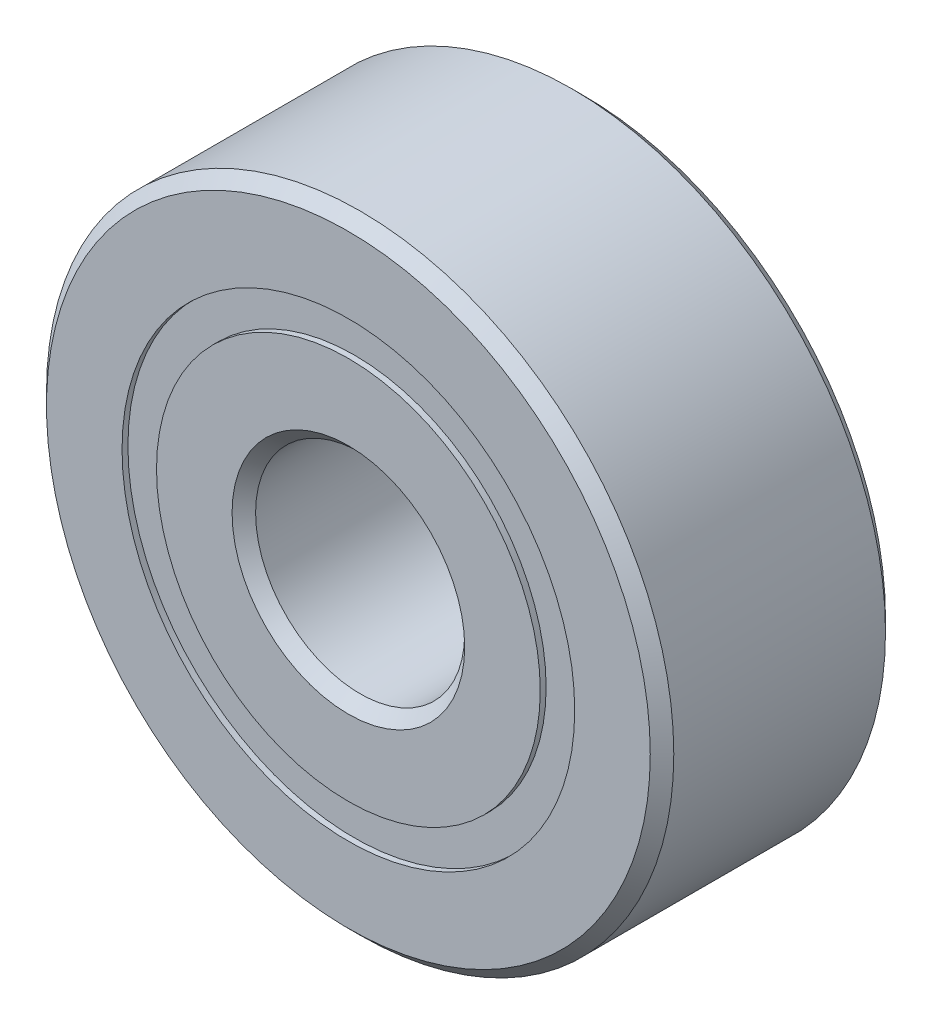
ISO-10303-21;
HEADER;
FILE_DESCRIPTION(('STEP AP214'),'2;1');
FILE_NAME('part.step','',(''),(''),'','','');
FILE_SCHEMA(('AUTOMOTIVE_DESIGN { 1 0 10303 214 1 1 1 1 }'));
ENDSEC;
DATA;
#1=APPLICATION_CONTEXT('core data for automotive mechanical design processes');
#2=APPLICATION_PROTOCOL_DEFINITION('international standard','automotive_design',2000,#1);
#3=PRODUCT_CONTEXT('',#1,'mechanical');
#4=PRODUCT('Part','Part','',(#3));
#5=PRODUCT_RELATED_PRODUCT_CATEGORY('part','',(#4));
#6=PRODUCT_DEFINITION_FORMATION('','',#4);
#7=PRODUCT_DEFINITION_CONTEXT('part definition',#1,'design');
#8=PRODUCT_DEFINITION('design','',#6,#7);
#9=PRODUCT_DEFINITION_SHAPE('','',#8);
#10=(LENGTH_UNIT() NAMED_UNIT(*) SI_UNIT(.MILLI.,.METRE.));
#11=(NAMED_UNIT(*) PLANE_ANGLE_UNIT() SI_UNIT($,.RADIAN.));
#12=(NAMED_UNIT(*) SI_UNIT($,.STERADIAN.) SOLID_ANGLE_UNIT());
#13=UNCERTAINTY_MEASURE_WITH_UNIT(LENGTH_MEASURE(1.E-05),#10,'distance_accuracy_value','');
#14=(GEOMETRIC_REPRESENTATION_CONTEXT(3) GLOBAL_UNCERTAINTY_ASSIGNED_CONTEXT((#13)) GLOBAL_UNIT_ASSIGNED_CONTEXT((#10,
#11,#12)) REPRESENTATION_CONTEXT('',''));
#15=CARTESIAN_POINT('',(0.,0.,0.));
#16=DIRECTION('',(0.,0.,1.));
#17=DIRECTION('',(1.,0.,0.));
#18=AXIS2_PLACEMENT_3D('',#15,#16,#17);
#19=CARTESIAN_POINT('',(0.,6.87335164835165,-3.39328125));
#20=DIRECTION('',(0.,0.,1.));
#21=DIRECTION('',(1.,0.,0.));
#22=AXIS2_PLACEMENT_3D('',#19,#20,#21);
#23=PLANE('',#22);
#24=CARTESIAN_POINT('',(0.,0.,-3.39328125));
#25=DIRECTION('',(0.,0.,1.));
#26=DIRECTION('',(1.,0.,0.));
#27=AXIS2_PLACEMENT_3D('',#24,#25,#26);
#28=CIRCLE('',#27,6.87335164835165);
#29=CARTESIAN_POINT('',(6.87335164835165,0.,-3.39328125));
#30=VERTEX_POINT('',#29);
#31=EDGE_CURVE('E58',#30,#30,#28,.T.);
#32=ORIENTED_EDGE('',*,*,#31,.F.);
#33=EDGE_LOOP('',(#32));
#34=FACE_BOUND('',#33,.T.);
#35=CARTESIAN_POINT('',(0.,0.,-3.39328125));
#36=DIRECTION('',(0.,0.,1.));
#37=DIRECTION('',(1.,0.,0.));
#38=AXIS2_PLACEMENT_3D('',#35,#36,#37);
#39=CIRCLE('',#38,5.82664835164835);
#40=CARTESIAN_POINT('',(5.82664835164835,0.,-3.39328125));
#41=VERTEX_POINT('',#40);
#42=EDGE_CURVE('E11',#41,#41,#39,.T.);
#43=ORIENTED_EDGE('',*,*,#42,.T.);
#44=EDGE_LOOP('',(#43));
#45=FACE_BOUND('',#44,.T.);
#46=ADVANCED_FACE('F44',(#34,#45),#23,.F.);
#47=CARTESIAN_POINT('',(0.,0.,3.571875));
#48=DIRECTION('',(0.,0.,1.));
#49=DIRECTION('',(1.,0.,0.));
#50=AXIS2_PLACEMENT_3D('',#47,#48,#49);
#51=CYLINDRICAL_SURFACE('',#50,5.82664835164835);
#52=ORIENTED_EDGE('',*,*,#42,.F.);
#53=EDGE_LOOP('',(#52));
#54=FACE_BOUND('',#53,.T.);
#55=CARTESIAN_POINT('',(0.,0.,-1.67154216154795));
#56=DIRECTION('',(0.,0.,1.));
#57=DIRECTION('',(1.,0.,0.));
#58=AXIS2_PLACEMENT_3D('',#55,#56,#57);
#59=CIRCLE('',#58,5.82664835164835);
#60=CARTESIAN_POINT('',(5.82664835164835,0.,-1.67154216154795));
#61=VERTEX_POINT('',#60);
#62=EDGE_CURVE('E50',#61,#61,#59,.T.);
#63=ORIENTED_EDGE('',*,*,#62,.T.);
#64=EDGE_LOOP('',(#63));
#65=FACE_BOUND('',#64,.T.);
#66=ADVANCED_FACE('F67',(#54,#65),#51,.F.);
#67=CARTESIAN_POINT('',(0.,6.87335164835165,-1.67154216154795));
#68=DIRECTION('',(0.,0.,-1.));
#69=DIRECTION('',(-1.,0.,0.));
#70=AXIS2_PLACEMENT_3D('',#67,#68,#69);
#71=PLANE('',#70);
#72=ORIENTED_EDGE('',*,*,#62,.F.);
#73=EDGE_LOOP('',(#72));
#74=FACE_BOUND('',#73,.T.);
#75=CARTESIAN_POINT('',(0.,0.,-1.67154216154795));
#76=DIRECTION('',(0.,0.,1.));
#77=DIRECTION('',(1.,0.,0.));
#78=AXIS2_PLACEMENT_3D('',#75,#76,#77);
#79=CIRCLE('',#78,6.87335164835165);
#80=CARTESIAN_POINT('',(6.87335164835165,0.,-1.67154216154795));
#81=VERTEX_POINT('',#80);
#82=EDGE_CURVE('E54',#81,#81,#79,.T.);
#83=ORIENTED_EDGE('',*,*,#82,.T.);
#84=EDGE_LOOP('',(#83));
#85=FACE_BOUND('',#84,.T.);
#86=ADVANCED_FACE('F71',(#74,#85),#71,.F.);
#87=CARTESIAN_POINT('',(0.,0.,3.571875));
#88=DIRECTION('',(0.,0.,1.));
#89=DIRECTION('',(1.,0.,0.));
#90=AXIS2_PLACEMENT_3D('',#87,#88,#89);
#91=CYLINDRICAL_SURFACE('',#90,6.87335164835165);
#92=ORIENTED_EDGE('',*,*,#82,.F.);
#93=EDGE_LOOP('',(#92));
#94=FACE_BOUND('',#93,.T.);
#95=ORIENTED_EDGE('',*,*,#31,.T.);
#96=EDGE_LOOP('',(#95));
#97=FACE_BOUND('',#96,.T.);
#98=ADVANCED_FACE('F64',(#94,#97),#91,.T.);
#99=CLOSED_SHELL('',(#46,#66,#86,#98));
#100=MANIFOLD_SOLID_BREP('B2',#99);
#101=CARTESIAN_POINT('',(0.,6.87335164835165,3.39328125));
#102=DIRECTION('',(0.,0.,-1.));
#103=DIRECTION('',(-1.,0.,0.));
#104=AXIS2_PLACEMENT_3D('',#101,#102,#103);
#105=PLANE('',#104);
#106=CARTESIAN_POINT('',(0.,0.,3.39328125));
#107=DIRECTION('',(0.,0.,1.));
#108=DIRECTION('',(1.,0.,0.));
#109=AXIS2_PLACEMENT_3D('',#106,#107,#108);
#110=CIRCLE('',#109,5.82664835164835);
#111=CARTESIAN_POINT('',(5.82664835164835,0.,3.39328125));
#112=VERTEX_POINT('',#111);
#113=EDGE_CURVE('E43',#112,#112,#110,.T.);
#114=ORIENTED_EDGE('',*,*,#113,.F.);
#115=EDGE_LOOP('',(#114));
#116=FACE_BOUND('',#115,.T.);
#117=CARTESIAN_POINT('',(0.,0.,3.39328125));
#118=DIRECTION('',(0.,0.,1.));
#119=DIRECTION('',(1.,0.,0.));
#120=AXIS2_PLACEMENT_3D('',#117,#118,#119);
#121=CIRCLE('',#120,6.87335164835165);
#122=CARTESIAN_POINT('',(6.87335164835165,0.,3.39328125));
#123=VERTEX_POINT('',#122);
#124=EDGE_CURVE('E126',#123,#123,#121,.T.);
#125=ORIENTED_EDGE('',*,*,#124,.T.);
#126=EDGE_LOOP('',(#125));
#127=FACE_BOUND('',#126,.T.);
#128=ADVANCED_FACE('F112',(#116,#127),#105,.F.);
#129=CARTESIAN_POINT('',(0.,0.,3.571875));
#130=DIRECTION('',(0.,0.,1.));
#131=DIRECTION('',(1.,0.,0.));
#132=AXIS2_PLACEMENT_3D('',#129,#130,#131);
#133=CYLINDRICAL_SURFACE('',#132,5.82664835164835);
#134=CARTESIAN_POINT('',(0.,0.,1.67154216154795));
#135=DIRECTION('',(0.,0.,1.));
#136=DIRECTION('',(1.,0.,0.));
#137=AXIS2_PLACEMENT_3D('',#134,#135,#136);
#138=CIRCLE('',#137,5.82664835164835);
#139=CARTESIAN_POINT('',(5.82664835164835,0.,1.67154216154795));
#140=VERTEX_POINT('',#139);
#141=EDGE_CURVE('E118',#140,#140,#138,.T.);
#142=ORIENTED_EDGE('',*,*,#141,.F.);
#143=EDGE_LOOP('',(#142));
#144=FACE_BOUND('',#143,.T.);
#145=ORIENTED_EDGE('',*,*,#113,.T.);
#146=EDGE_LOOP('',(#145));
#147=FACE_BOUND('',#146,.T.);
#148=ADVANCED_FACE('F141',(#144,#147),#133,.F.);
#149=CARTESIAN_POINT('',(0.,6.87335164835165,1.67154216154795));
#150=DIRECTION('',(0.,0.,1.));
#151=DIRECTION('',(1.,0.,0.));
#152=AXIS2_PLACEMENT_3D('',#149,#150,#151);
#153=PLANE('',#152);
#154=CARTESIAN_POINT('',(0.,0.,1.67154216154795));
#155=DIRECTION('',(0.,0.,1.));
#156=DIRECTION('',(1.,0.,0.));
#157=AXIS2_PLACEMENT_3D('',#154,#155,#156);
#158=CIRCLE('',#157,6.87335164835165);
#159=CARTESIAN_POINT('',(6.87335164835165,0.,1.67154216154795));
#160=VERTEX_POINT('',#159);
#161=EDGE_CURVE('E122',#160,#160,#158,.T.);
#162=ORIENTED_EDGE('',*,*,#161,.F.);
#163=EDGE_LOOP('',(#162));
#164=FACE_BOUND('',#163,.T.);
#165=ORIENTED_EDGE('',*,*,#141,.T.);
#166=EDGE_LOOP('',(#165));
#167=FACE_BOUND('',#166,.T.);
#168=ADVANCED_FACE('F136',(#164,#167),#153,.F.);
#169=CARTESIAN_POINT('',(0.,0.,3.571875));
#170=DIRECTION('',(0.,0.,1.));
#171=DIRECTION('',(1.,0.,0.));
#172=AXIS2_PLACEMENT_3D('',#169,#170,#171);
#173=CYLINDRICAL_SURFACE('',#172,6.87335164835165);
#174=ORIENTED_EDGE('',*,*,#124,.F.);
#175=EDGE_LOOP('',(#174));
#176=FACE_BOUND('',#175,.T.);
#177=ORIENTED_EDGE('',*,*,#161,.T.);
#178=EDGE_LOOP('',(#177));
#179=FACE_BOUND('',#178,.T.);
#180=ADVANCED_FACE('F133',(#176,#179),#173,.T.);
#181=CLOSED_SHELL('',(#128,#148,#168,#180));
#182=MANIFOLD_SOLID_BREP('B6',#181);
#183=CARTESIAN_POINT('',(-4.49012806053452,4.49012806053463,0.));
#184=DIRECTION('',(0.,0.,1.));
#185=DIRECTION('',(-0.707106781186539,0.707106781186556,0.));
#186=AXIS2_PLACEMENT_3D('',#183,#184,#185);
#187=SPHERICAL_SURFACE('',#186,1.67154216154795);
#188=CARTESIAN_POINT('',(-4.49012806053452,4.49012806053463,1.67154216154795));
#189=VERTEX_POINT('',#188);
#190=VERTEX_LOOP('',#189);
#191=FACE_BOUND('',#190,.T.);
#192=ADVANCED_FACE('F180',(#191),#187,.T.);
#193=CLOSED_SHELL('',(#192));
#194=MANIFOLD_SOLID_BREP('B38',#193);
#195=CARTESIAN_POINT('',(-6.35,0.,0.));
#196=DIRECTION('',(0.,0.,1.));
#197=DIRECTION('',(-1.,0.,0.));
#198=AXIS2_PLACEMENT_3D('',#195,#196,#197);
#199=SPHERICAL_SURFACE('',#198,1.67154216154795);
#200=CARTESIAN_POINT('',(-6.35,0.,1.67154216154795));
#201=VERTEX_POINT('',#200);
#202=VERTEX_LOOP('',#201);
#203=FACE_BOUND('',#202,.T.);
#204=ADVANCED_FACE('F201',(#203),#199,.T.);
#205=CLOSED_SHELL('',(#204));
#206=MANIFOLD_SOLID_BREP('B108',#205);
#207=CARTESIAN_POINT('',(-4.49012806053462,-4.49012806053454,0.));
#208=DIRECTION('',(0.,0.,1.));
#209=DIRECTION('',(-0.707106781186554,-0.707106781186541,0.));
#210=AXIS2_PLACEMENT_3D('',#207,#208,#209);
#211=SPHERICAL_SURFACE('',#210,1.67154216154795);
#212=CARTESIAN_POINT('',(-4.49012806053462,-4.49012806053454,1.67154216154795));
#213=VERTEX_POINT('',#212);
#214=VERTEX_LOOP('',#213);
#215=FACE_BOUND('',#214,.T.);
#216=ADVANCED_FACE('F222',(#215),#211,.T.);
#217=CLOSED_SHELL('',(#216));
#218=MANIFOLD_SOLID_BREP('B176',#217);
#219=CARTESIAN_POINT('',(0.,-6.35,0.));
#220=DIRECTION('',(0.,0.,1.));
#221=DIRECTION('',(0.,-1.,0.));
#222=AXIS2_PLACEMENT_3D('',#219,#220,#221);
#223=SPHERICAL_SURFACE('',#222,1.67154216154795);
#224=CARTESIAN_POINT('',(0.,-6.35,1.67154216154795));
#225=VERTEX_POINT('',#224);
#226=VERTEX_LOOP('',#225);
#227=FACE_BOUND('',#226,.T.);
#228=ADVANCED_FACE('F243',(#227),#223,.T.);
#229=CLOSED_SHELL('',(#228));
#230=MANIFOLD_SOLID_BREP('B197',#229);
#231=CARTESIAN_POINT('',(4.49012806053455,-4.4901280605346,0.));
#232=DIRECTION('',(0.,0.,1.));
#233=DIRECTION('',(0.707106781186544,-0.707106781186551,0.));
#234=AXIS2_PLACEMENT_3D('',#231,#232,#233);
#235=SPHERICAL_SURFACE('',#234,1.67154216154795);
#236=CARTESIAN_POINT('',(4.49012806053455,-4.4901280605346,1.67154216154795));
#237=VERTEX_POINT('',#236);
#238=VERTEX_LOOP('',#237);
#239=FACE_BOUND('',#238,.T.);
#240=ADVANCED_FACE('F264',(#239),#235,.T.);
#241=CLOSED_SHELL('',(#240));
#242=MANIFOLD_SOLID_BREP('B218',#241);
#243=CARTESIAN_POINT('',(6.35,0.,0.));
#244=DIRECTION('',(0.,0.,1.));
#245=DIRECTION('',(1.,0.,0.));
#246=AXIS2_PLACEMENT_3D('',#243,#244,#245);
#247=SPHERICAL_SURFACE('',#246,1.67154216154795);
#248=CARTESIAN_POINT('',(6.35,0.,1.67154216154795));
#249=VERTEX_POINT('',#248);
#250=VERTEX_LOOP('',#249);
#251=FACE_BOUND('',#250,.T.);
#252=ADVANCED_FACE('F285',(#251),#247,.T.);
#253=CLOSED_SHELL('',(#252));
#254=MANIFOLD_SOLID_BREP('B239',#253);
#255=CARTESIAN_POINT('',(4.49012806053458,4.49012806053457,0.));
#256=DIRECTION('',(0.,0.,1.));
#257=DIRECTION('',(0.707106781186549,0.707106781186546,0.));
#258=AXIS2_PLACEMENT_3D('',#255,#256,#257);
#259=SPHERICAL_SURFACE('',#258,1.67154216154795);
#260=CARTESIAN_POINT('',(4.49012806053458,4.49012806053457,1.67154216154795));
#261=VERTEX_POINT('',#260);
#262=VERTEX_LOOP('',#261);
#263=FACE_BOUND('',#262,.T.);
#264=ADVANCED_FACE('F306',(#263),#259,.T.);
#265=CLOSED_SHELL('',(#264));
#266=MANIFOLD_SOLID_BREP('B260',#265);
#267=CARTESIAN_POINT('',(0.,6.35,0.));
#268=DIRECTION('',(0.,0.,1.));
#269=DIRECTION('',(0.,1.,0.));
#270=AXIS2_PLACEMENT_3D('',#267,#268,#269);
#271=SPHERICAL_SURFACE('',#270,1.67154216154795);
#272=CARTESIAN_POINT('',(0.,6.35,1.67154216154795));
#273=VERTEX_POINT('',#272);
#274=VERTEX_LOOP('',#273);
#275=FACE_BOUND('',#274,.T.);
#276=ADVANCED_FACE('F329',(#275),#271,.T.);
#277=CLOSED_SHELL('',(#276));
#278=MANIFOLD_SOLID_BREP('B281',#277);
#279=CARTESIAN_POINT('',(0.,5.82664835164835,3.571875));
#280=DIRECTION('',(0.,0.,-1.));
#281=DIRECTION('',(-1.,0.,0.));
#282=AXIS2_PLACEMENT_3D('',#279,#280,#281);
#283=PLANE('',#282);
#284=CARTESIAN_POINT('',(0.,0.,3.571875));
#285=DIRECTION('',(0.,0.,1.));
#286=DIRECTION('',(1.,0.,0.));
#287=AXIS2_PLACEMENT_3D('',#284,#285,#286);
#288=CIRCLE('',#287,3.5321875);
#289=CARTESIAN_POINT('',(3.5321875,0.,3.571875));
#290=VERTEX_POINT('',#289);
#291=EDGE_CURVE('E377',#290,#290,#288,.T.);
#292=ORIENTED_EDGE('',*,*,#291,.F.);
#293=EDGE_LOOP('',(#292));
#294=FACE_BOUND('',#293,.T.);
#295=CARTESIAN_POINT('',(0.,0.,3.571875));
#296=DIRECTION('',(0.,0.,1.));
#297=DIRECTION('',(1.,0.,0.));
#298=AXIS2_PLACEMENT_3D('',#295,#296,#297);
#299=CIRCLE('',#298,5.82664835164835);
#300=CARTESIAN_POINT('',(5.82664835164835,0.,3.571875));
#301=VERTEX_POINT('',#300);
#302=EDGE_CURVE('E328',#301,#301,#299,.T.);
#303=ORIENTED_EDGE('',*,*,#302,.T.);
#304=EDGE_LOOP('',(#303));
#305=FACE_BOUND('',#304,.T.);
#306=ADVANCED_FACE('F349',(#294,#305),#283,.F.);
#307=CARTESIAN_POINT('',(0.,0.,3.571875));
#308=DIRECTION('',(0.,0.,1.));
#309=DIRECTION('',(1.,0.,0.));
#310=AXIS2_PLACEMENT_3D('',#307,#308,#309);
#311=CYLINDRICAL_SURFACE('',#310,5.82664835164835);
#312=ORIENTED_EDGE('',*,*,#302,.F.);
#313=EDGE_LOOP('',(#312));
#314=FACE_BOUND('',#313,.T.);
#315=CARTESIAN_POINT('',(0.,0.,1.5875));
#316=DIRECTION('',(0.,0.,1.));
#317=DIRECTION('',(1.,0.,0.));
#318=AXIS2_PLACEMENT_3D('',#315,#316,#317);
#319=CIRCLE('',#318,5.82664835164835);
#320=CARTESIAN_POINT('',(5.82664835164835,0.,1.5875));
#321=VERTEX_POINT('',#320);
#322=EDGE_CURVE('E355',#321,#321,#319,.T.);
#323=ORIENTED_EDGE('',*,*,#322,.T.);
#324=EDGE_LOOP('',(#323));
#325=FACE_BOUND('',#324,.T.);
#326=ADVANCED_FACE('F384',(#314,#325),#311,.T.);
#327=CARTESIAN_POINT('',(0.,0.,0.));
#328=DIRECTION('',(0.,0.,1.));
#329=DIRECTION('',(1.,0.,0.));
#330=AXIS2_PLACEMENT_3D('',#327,#328,#329);
#331=TOROIDAL_SURFACE('',#330,6.35,1.67154216154795);
#332=ORIENTED_EDGE('',*,*,#322,.F.);
#333=EDGE_LOOP('',(#332));
#334=FACE_BOUND('',#333,.T.);
#335=CARTESIAN_POINT('',(0.,0.,-1.5875));
#336=DIRECTION('',(0.,0.,1.));
#337=DIRECTION('',(1.,0.,0.));
#338=AXIS2_PLACEMENT_3D('',#335,#336,#337);
#339=CIRCLE('',#338,5.82664835164835);
#340=CARTESIAN_POINT('',(5.82664835164835,0.,-1.5875));
#341=VERTEX_POINT('',#340);
#342=EDGE_CURVE('E359',#341,#341,#339,.T.);
#343=ORIENTED_EDGE('',*,*,#342,.T.);
#344=EDGE_LOOP('',(#343));
#345=FACE_BOUND('',#344,.T.);
#346=ADVANCED_FACE('F388',(#334,#345),#331,.F.);
#347=CARTESIAN_POINT('',(0.,0.,3.571875));
#348=DIRECTION('',(0.,0.,1.));
#349=DIRECTION('',(1.,0.,0.));
#350=AXIS2_PLACEMENT_3D('',#347,#348,#349);
#351=CYLINDRICAL_SURFACE('',#350,5.82664835164835);
#352=ORIENTED_EDGE('',*,*,#342,.F.);
#353=EDGE_LOOP('',(#352));
#354=FACE_BOUND('',#353,.T.);
#355=CARTESIAN_POINT('',(0.,0.,-3.571875));
#356=DIRECTION('',(0.,0.,1.));
#357=DIRECTION('',(1.,0.,0.));
#358=AXIS2_PLACEMENT_3D('',#355,#356,#357);
#359=CIRCLE('',#358,5.82664835164835);
#360=CARTESIAN_POINT('',(5.82664835164835,0.,-3.571875));
#361=VERTEX_POINT('',#360);
#362=EDGE_CURVE('E363',#361,#361,#359,.T.);
#363=ORIENTED_EDGE('',*,*,#362,.T.);
#364=EDGE_LOOP('',(#363));
#365=FACE_BOUND('',#364,.T.);
#366=ADVANCED_FACE('F393',(#354,#365),#351,.T.);
#367=CARTESIAN_POINT('',(0.,3.5321875,-3.571875));
#368=DIRECTION('',(0.,0.,1.));
#369=DIRECTION('',(1.,0.,0.));
#370=AXIS2_PLACEMENT_3D('',#367,#368,#369);
#371=PLANE('',#370);
#372=ORIENTED_EDGE('',*,*,#362,.F.);
#373=EDGE_LOOP('',(#372));
#374=FACE_BOUND('',#373,.T.);
#375=CARTESIAN_POINT('',(0.,0.,-3.571875));
#376=DIRECTION('',(0.,0.,1.));
#377=DIRECTION('',(1.,0.,0.));
#378=AXIS2_PLACEMENT_3D('',#375,#376,#377);
#379=CIRCLE('',#378,3.5321875);
#380=CARTESIAN_POINT('',(3.5321875,0.,-3.571875));
#381=VERTEX_POINT('',#380);
#382=EDGE_CURVE('E368',#381,#381,#379,.T.);
#383=ORIENTED_EDGE('',*,*,#382,.T.);
#384=EDGE_LOOP('',(#383));
#385=FACE_BOUND('',#384,.T.);
#386=ADVANCED_FACE('F399',(#374,#385),#371,.F.);
#387=CARTESIAN_POINT('',(0.,0.,-3.2146875));
#388=DIRECTION('',(0.,0.,-1.));
#389=DIRECTION('',(-1.,0.,0.));
#390=AXIS2_PLACEMENT_3D('',#387,#388,#389);
#391=CONICAL_SURFACE('',#390,3.175,0.785398163397444);
#392=ORIENTED_EDGE('',*,*,#382,.F.);
#393=EDGE_LOOP('',(#392));
#394=FACE_BOUND('',#393,.T.);
#395=CARTESIAN_POINT('',(0.,0.,-3.2146875));
#396=DIRECTION('',(0.,0.,1.));
#397=DIRECTION('',(1.,0.,0.));
#398=AXIS2_PLACEMENT_3D('',#395,#396,#397);
#399=CIRCLE('',#398,3.175);
#400=CARTESIAN_POINT('',(3.175,0.,-3.2146875));
#401=VERTEX_POINT('',#400);
#402=EDGE_CURVE('E371',#401,#401,#399,.T.);
#403=ORIENTED_EDGE('',*,*,#402,.T.);
#404=EDGE_LOOP('',(#403));
#405=FACE_BOUND('',#404,.T.);
#406=ADVANCED_FACE('F403',(#394,#405),#391,.F.);
#407=CARTESIAN_POINT('',(0.,0.,3.571875));
#408=DIRECTION('',(0.,0.,1.));
#409=DIRECTION('',(1.,0.,0.));
#410=AXIS2_PLACEMENT_3D('',#407,#408,#409);
#411=CYLINDRICAL_SURFACE('',#410,3.175);
#412=ORIENTED_EDGE('',*,*,#402,.F.);
#413=EDGE_LOOP('',(#412));
#414=FACE_BOUND('',#413,.T.);
#415=CARTESIAN_POINT('',(0.,0.,3.2146875));
#416=DIRECTION('',(0.,0.,1.));
#417=DIRECTION('',(1.,0.,0.));
#418=AXIS2_PLACEMENT_3D('',#415,#416,#417);
#419=CIRCLE('',#418,3.175);
#420=CARTESIAN_POINT('',(3.175,0.,3.2146875));
#421=VERTEX_POINT('',#420);
#422=EDGE_CURVE('E374',#421,#421,#419,.T.);
#423=ORIENTED_EDGE('',*,*,#422,.T.);
#424=EDGE_LOOP('',(#423));
#425=FACE_BOUND('',#424,.T.);
#426=ADVANCED_FACE('F407',(#414,#425),#411,.F.);
#427=CARTESIAN_POINT('',(0.,0.,3.571875));
#428=DIRECTION('',(0.,0.,1.));
#429=DIRECTION('',(1.,0.,0.));
#430=AXIS2_PLACEMENT_3D('',#427,#428,#429);
#431=CONICAL_SURFACE('',#430,3.5321875,0.785398163397454);
#432=ORIENTED_EDGE('',*,*,#422,.F.);
#433=EDGE_LOOP('',(#432));
#434=FACE_BOUND('',#433,.T.);
#435=ORIENTED_EDGE('',*,*,#291,.T.);
#436=EDGE_LOOP('',(#435));
#437=FACE_BOUND('',#436,.T.);
#438=ADVANCED_FACE('F381',(#434,#437),#431,.F.);
#439=CLOSED_SHELL('',(#306,#326,#346,#366,#386,#406,#426,#438));
#440=MANIFOLD_SOLID_BREP('B302',#439);
#441=CARTESIAN_POINT('',(0.,0.,3.2146875));
#442=DIRECTION('',(0.,0.,-1.));
#443=DIRECTION('',(-1.,0.,0.));
#444=AXIS2_PLACEMENT_3D('',#441,#442,#443);
#445=CONICAL_SURFACE('',#444,9.525,0.785398163397448);
#446=CARTESIAN_POINT('',(0.,0.,3.571875));
#447=DIRECTION('',(0.,0.,1.));
#448=DIRECTION('',(1.,0.,0.));
#449=AXIS2_PLACEMENT_3D('',#446,#447,#448);
#450=CIRCLE('',#449,9.1678125);
#451=CARTESIAN_POINT('',(9.1678125,0.,3.571875));
#452=VERTEX_POINT('',#451);
#453=EDGE_CURVE('E499',#452,#452,#450,.T.);
#454=ORIENTED_EDGE('',*,*,#453,.F.);
#455=EDGE_LOOP('',(#454));
#456=FACE_BOUND('',#455,.T.);
#457=CARTESIAN_POINT('',(0.,0.,3.2146875));
#458=DIRECTION('',(0.,0.,1.));
#459=DIRECTION('',(1.,0.,0.));
#460=AXIS2_PLACEMENT_3D('',#457,#458,#459);
#461=CIRCLE('',#460,9.525);
#462=CARTESIAN_POINT('',(9.525,0.,3.2146875));
#463=VERTEX_POINT('',#462);
#464=EDGE_CURVE('E348',#463,#463,#461,.T.);
#465=ORIENTED_EDGE('',*,*,#464,.T.);
#466=EDGE_LOOP('',(#465));
#467=FACE_BOUND('',#466,.T.);
#468=ADVANCED_FACE('F471',(#456,#467),#445,.T.);
#469=CARTESIAN_POINT('',(0.,0.,3.571875));
#470=DIRECTION('',(0.,0.,1.));
#471=DIRECTION('',(1.,0.,0.));
#472=AXIS2_PLACEMENT_3D('',#469,#470,#471);
#473=CYLINDRICAL_SURFACE('',#472,9.525);
#474=ORIENTED_EDGE('',*,*,#464,.F.);
#475=EDGE_LOOP('',(#474));
#476=FACE_BOUND('',#475,.T.);
#477=CARTESIAN_POINT('',(0.,0.,-3.2146875));
#478=DIRECTION('',(0.,0.,1.));
#479=DIRECTION('',(1.,0.,0.));
#480=AXIS2_PLACEMENT_3D('',#477,#478,#479);
#481=CIRCLE('',#480,9.525);
#482=CARTESIAN_POINT('',(9.525,0.,-3.2146875));
#483=VERTEX_POINT('',#482);
#484=EDGE_CURVE('E477',#483,#483,#481,.T.);
#485=ORIENTED_EDGE('',*,*,#484,.T.);
#486=EDGE_LOOP('',(#485));
#487=FACE_BOUND('',#486,.T.);
#488=ADVANCED_FACE('F506',(#476,#487),#473,.T.);
#489=CARTESIAN_POINT('',(0.,0.,-3.571875));
#490=DIRECTION('',(0.,0.,1.));
#491=DIRECTION('',(1.,0.,0.));
#492=AXIS2_PLACEMENT_3D('',#489,#490,#491);
#493=CONICAL_SURFACE('',#492,9.1678125,0.785398163397445);
#494=ORIENTED_EDGE('',*,*,#484,.F.);
#495=EDGE_LOOP('',(#494));
#496=FACE_BOUND('',#495,.T.);
#497=CARTESIAN_POINT('',(0.,0.,-3.571875));
#498=DIRECTION('',(0.,0.,1.));
#499=DIRECTION('',(1.,0.,0.));
#500=AXIS2_PLACEMENT_3D('',#497,#498,#499);
#501=CIRCLE('',#500,9.1678125);
#502=CARTESIAN_POINT('',(9.1678125,0.,-3.571875));
#503=VERTEX_POINT('',#502);
#504=EDGE_CURVE('E481',#503,#503,#501,.T.);
#505=ORIENTED_EDGE('',*,*,#504,.T.);
#506=EDGE_LOOP('',(#505));
#507=FACE_BOUND('',#506,.T.);
#508=ADVANCED_FACE('F510',(#496,#507),#493,.T.);
#509=CARTESIAN_POINT('',(0.,9.1678125,-3.571875));
#510=DIRECTION('',(0.,0.,1.));
#511=DIRECTION('',(1.,0.,0.));
#512=AXIS2_PLACEMENT_3D('',#509,#510,#511);
#513=PLANE('',#512);
#514=ORIENTED_EDGE('',*,*,#504,.F.);
#515=EDGE_LOOP('',(#514));
#516=FACE_BOUND('',#515,.T.);
#517=CARTESIAN_POINT('',(0.,0.,-3.571875));
#518=DIRECTION('',(0.,0.,1.));
#519=DIRECTION('',(1.,0.,0.));
#520=AXIS2_PLACEMENT_3D('',#517,#518,#519);
#521=CIRCLE('',#520,6.87335164835165);
#522=CARTESIAN_POINT('',(6.87335164835165,0.,-3.571875));
#523=VERTEX_POINT('',#522);
#524=EDGE_CURVE('E485',#523,#523,#521,.T.);
#525=ORIENTED_EDGE('',*,*,#524,.T.);
#526=EDGE_LOOP('',(#525));
#527=FACE_BOUND('',#526,.T.);
#528=ADVANCED_FACE('F515',(#516,#527),#513,.F.);
#529=CARTESIAN_POINT('',(0.,0.,3.571875));
#530=DIRECTION('',(0.,0.,1.));
#531=DIRECTION('',(1.,0.,0.));
#532=AXIS2_PLACEMENT_3D('',#529,#530,#531);
#533=CYLINDRICAL_SURFACE('',#532,6.87335164835165);
#534=ORIENTED_EDGE('',*,*,#524,.F.);
#535=EDGE_LOOP('',(#534));
#536=FACE_BOUND('',#535,.T.);
#537=CARTESIAN_POINT('',(0.,0.,-1.5875));
#538=DIRECTION('',(0.,0.,1.));
#539=DIRECTION('',(1.,0.,0.));
#540=AXIS2_PLACEMENT_3D('',#537,#538,#539);
#541=CIRCLE('',#540,6.87335164835165);
#542=CARTESIAN_POINT('',(6.87335164835165,0.,-1.5875));
#543=VERTEX_POINT('',#542);
#544=EDGE_CURVE('E490',#543,#543,#541,.T.);
#545=ORIENTED_EDGE('',*,*,#544,.T.);
#546=EDGE_LOOP('',(#545));
#547=FACE_BOUND('',#546,.T.);
#548=ADVANCED_FACE('F521',(#536,#547),#533,.F.);
#549=CARTESIAN_POINT('',(0.,0.,0.));
#550=DIRECTION('',(0.,0.,1.));
#551=DIRECTION('',(1.,0.,0.));
#552=AXIS2_PLACEMENT_3D('',#549,#550,#551);
#553=TOROIDAL_SURFACE('',#552,6.35,1.67154216154795);
#554=ORIENTED_EDGE('',*,*,#544,.F.);
#555=EDGE_LOOP('',(#554));
#556=FACE_BOUND('',#555,.T.);
#557=CARTESIAN_POINT('',(0.,0.,1.5875));
#558=DIRECTION('',(0.,0.,1.));
#559=DIRECTION('',(1.,0.,0.));
#560=AXIS2_PLACEMENT_3D('',#557,#558,#559);
#561=CIRCLE('',#560,6.87335164835165);
#562=CARTESIAN_POINT('',(6.87335164835165,0.,1.5875));
#563=VERTEX_POINT('',#562);
#564=EDGE_CURVE('E493',#563,#563,#561,.T.);
#565=ORIENTED_EDGE('',*,*,#564,.T.);
#566=EDGE_LOOP('',(#565));
#567=FACE_BOUND('',#566,.T.);
#568=ADVANCED_FACE('F525',(#556,#567),#553,.F.);
#569=CARTESIAN_POINT('',(0.,0.,3.571875));
#570=DIRECTION('',(0.,0.,1.));
#571=DIRECTION('',(1.,0.,0.));
#572=AXIS2_PLACEMENT_3D('',#569,#570,#571);
#573=CYLINDRICAL_SURFACE('',#572,6.87335164835165);
#574=ORIENTED_EDGE('',*,*,#564,.F.);
#575=EDGE_LOOP('',(#574));
#576=FACE_BOUND('',#575,.T.);
#577=CARTESIAN_POINT('',(0.,0.,3.571875));
#578=DIRECTION('',(0.,0.,1.));
#579=DIRECTION('',(1.,0.,0.));
#580=AXIS2_PLACEMENT_3D('',#577,#578,#579);
#581=CIRCLE('',#580,6.87335164835165);
#582=CARTESIAN_POINT('',(6.87335164835165,0.,3.571875));
#583=VERTEX_POINT('',#582);
#584=EDGE_CURVE('E496',#583,#583,#581,.T.);
#585=ORIENTED_EDGE('',*,*,#584,.T.);
#586=EDGE_LOOP('',(#585));
#587=FACE_BOUND('',#586,.T.);
#588=ADVANCED_FACE('F529',(#576,#587),#573,.F.);
#589=CARTESIAN_POINT('',(0.,9.1678125,3.571875));
#590=DIRECTION('',(0.,0.,-1.));
#591=DIRECTION('',(-1.,0.,0.));
#592=AXIS2_PLACEMENT_3D('',#589,#590,#591);
#593=PLANE('',#592);
#594=ORIENTED_EDGE('',*,*,#584,.F.);
#595=EDGE_LOOP('',(#594));
#596=FACE_BOUND('',#595,.T.);
#597=ORIENTED_EDGE('',*,*,#453,.T.);
#598=EDGE_LOOP('',(#597));
#599=FACE_BOUND('',#598,.T.);
#600=ADVANCED_FACE('F503',(#596,#599),#593,.F.);
#601=CLOSED_SHELL('',(#468,#488,#508,#528,#548,#568,#588,#600));
#602=MANIFOLD_SOLID_BREP('B323',#601);
#603=ADVANCED_BREP_SHAPE_REPRESENTATION('',(#18,#100,#182,#194,#206,#218,#230,#242,#254,#266,
#278,#440,#602),#14);
#604=SHAPE_DEFINITION_REPRESENTATION(#9,#603);
ENDSEC;
END-ISO-10303-21;
